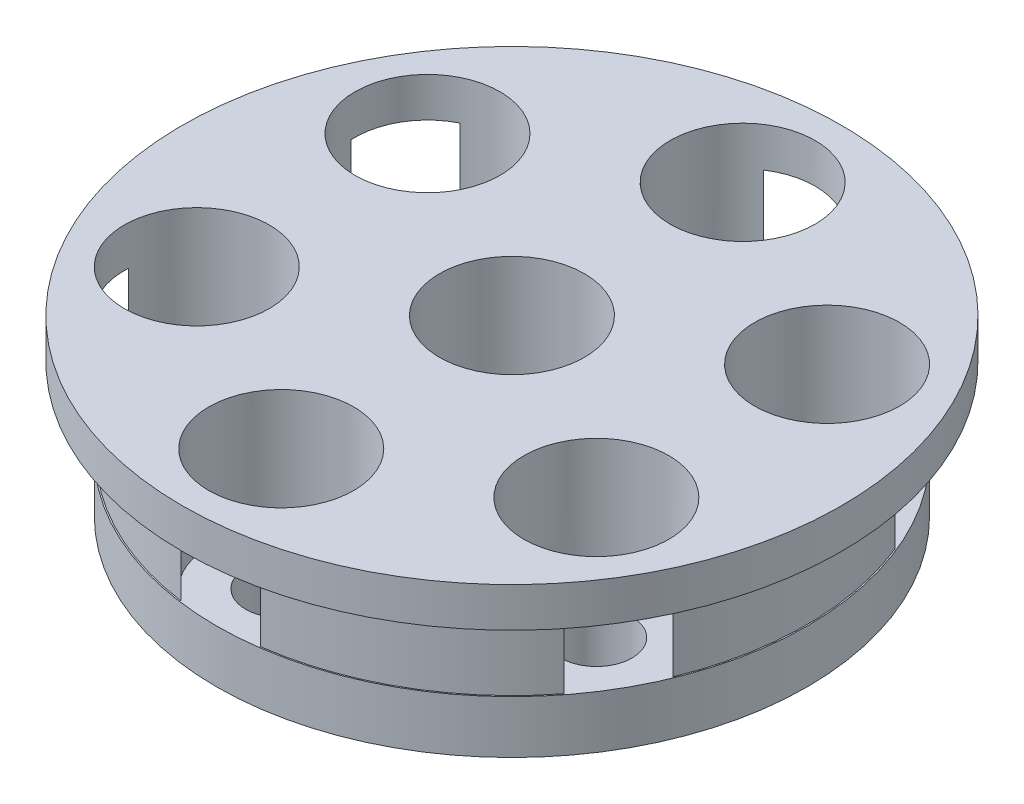
ISO-10303-21;
HEADER;
FILE_DESCRIPTION(('STEP AP214'),'2;1');
FILE_NAME('part.step','',(''),(''),'','','');
FILE_SCHEMA(('AUTOMOTIVE_DESIGN { 1 0 10303 214 1 1 1 1 }'));
ENDSEC;
DATA;
#1=APPLICATION_CONTEXT('core data for automotive mechanical design processes');
#2=APPLICATION_PROTOCOL_DEFINITION('international standard','automotive_design',2000,#1);
#3=PRODUCT_CONTEXT('',#1,'mechanical');
#4=PRODUCT('Part','Part','',(#3));
#5=PRODUCT_RELATED_PRODUCT_CATEGORY('part','',(#4));
#6=PRODUCT_DEFINITION_FORMATION('','',#4);
#7=PRODUCT_DEFINITION_CONTEXT('part definition',#1,'design');
#8=PRODUCT_DEFINITION('design','',#6,#7);
#9=PRODUCT_DEFINITION_SHAPE('','',#8);
#10=(LENGTH_UNIT() NAMED_UNIT(*) SI_UNIT(.MILLI.,.METRE.));
#11=(NAMED_UNIT(*) PLANE_ANGLE_UNIT() SI_UNIT($,.RADIAN.));
#12=(NAMED_UNIT(*) SI_UNIT($,.STERADIAN.) SOLID_ANGLE_UNIT());
#13=UNCERTAINTY_MEASURE_WITH_UNIT(LENGTH_MEASURE(1.E-05),#10,'distance_accuracy_value','');
#14=(GEOMETRIC_REPRESENTATION_CONTEXT(3) GLOBAL_UNCERTAINTY_ASSIGNED_CONTEXT((#13)) GLOBAL_UNIT_ASSIGNED_CONTEXT((#10,
#11,#12)) REPRESENTATION_CONTEXT('',''));
#15=CARTESIAN_POINT('',(0.,0.,0.));
#16=DIRECTION('',(0.,0.,1.));
#17=DIRECTION('',(1.,0.,0.));
#18=AXIS2_PLACEMENT_3D('',#15,#16,#17);
#19=CARTESIAN_POINT('',(0.,4.,0.));
#20=DIRECTION('',(0.,1.,0.));
#21=DIRECTION('',(0.,0.,1.));
#22=AXIS2_PLACEMENT_3D('',#19,#20,#21);
#23=PLANE('',#22);
#24=CARTESIAN_POINT('',(0.,4.,0.));
#25=DIRECTION('',(0.,1.,0.));
#26=DIRECTION('',(0.,0.,1.));
#27=AXIS2_PLACEMENT_3D('',#24,#25,#26);
#28=CIRCLE('',#27,22.4);
#29=CARTESIAN_POINT('',(0.,4.,22.4));
#30=VERTEX_POINT('',#29);
#31=EDGE_CURVE('E11',#30,#30,#28,.T.);
#32=ORIENTED_EDGE('',*,*,#31,.T.);
#33=EDGE_LOOP('',(#32));
#34=FACE_BOUND('',#33,.T.);
#35=CARTESIAN_POINT('',(-15.1554445662274,4.,-8.74999999999956));
#36=DIRECTION('',(0.,1.,0.));
#37=DIRECTION('',(0.,0.,1.));
#38=AXIS2_PLACEMENT_3D('',#35,#36,#37);
#39=CIRCLE('',#38,2.69999999999986);
#40=CARTESIAN_POINT('',(-15.1554445662274,4.,-6.04999999999971));
#41=VERTEX_POINT('',#40);
#42=EDGE_CURVE('E57',#41,#41,#39,.T.);
#43=ORIENTED_EDGE('',*,*,#42,.F.);
#44=EDGE_LOOP('',(#43));
#45=FACE_BOUND('',#44,.T.);
#46=CARTESIAN_POINT('',(0.,4.,-17.5));
#47=DIRECTION('',(0.,1.,0.));
#48=DIRECTION('',(0.,0.,1.));
#49=AXIS2_PLACEMENT_3D('',#46,#47,#48);
#50=CIRCLE('',#49,2.7);
#51=CARTESIAN_POINT('',(0.,4.,-14.8));
#52=VERTEX_POINT('',#51);
#53=EDGE_CURVE('E319',#52,#52,#50,.T.);
#54=ORIENTED_EDGE('',*,*,#53,.F.);
#55=EDGE_LOOP('',(#54));
#56=FACE_BOUND('',#55,.T.);
#57=CARTESIAN_POINT('',(15.1554445662276,4.,-8.75000000000018));
#58=DIRECTION('',(0.,1.,0.));
#59=DIRECTION('',(0.,0.,1.));
#60=AXIS2_PLACEMENT_3D('',#57,#58,#59);
#61=CIRCLE('',#60,2.7);
#62=CARTESIAN_POINT('',(15.1554445662276,4.,-6.05000000000019));
#63=VERTEX_POINT('',#62);
#64=EDGE_CURVE('E315',#63,#63,#61,.T.);
#65=ORIENTED_EDGE('',*,*,#64,.F.);
#66=EDGE_LOOP('',(#65));
#67=FACE_BOUND('',#66,.T.);
#68=CARTESIAN_POINT('',(15.1554445662284,4.,8.74999999999957));
#69=DIRECTION('',(0.,1.,0.));
#70=DIRECTION('',(0.,0.,1.));
#71=AXIS2_PLACEMENT_3D('',#68,#69,#70);
#72=CIRCLE('',#71,2.69999999999875);
#73=CARTESIAN_POINT('',(15.1554445662284,4.,11.4499999999983));
#74=VERTEX_POINT('',#73);
#75=EDGE_CURVE('E311',#74,#74,#72,.T.);
#76=ORIENTED_EDGE('',*,*,#75,.F.);
#77=EDGE_LOOP('',(#76));
#78=FACE_BOUND('',#77,.T.);
#79=CARTESIAN_POINT('',(9.88330434368617E-13,4.,17.5));
#80=DIRECTION('',(0.,1.,0.));
#81=DIRECTION('',(0.,0.,1.));
#82=AXIS2_PLACEMENT_3D('',#79,#80,#81);
#83=CIRCLE('',#82,2.69999999999939);
#84=CARTESIAN_POINT('',(9.88330434368617E-13,4.,20.1999999999994));
#85=VERTEX_POINT('',#84);
#86=EDGE_CURVE('E307',#85,#85,#83,.T.);
#87=ORIENTED_EDGE('',*,*,#86,.F.);
#88=EDGE_LOOP('',(#87));
#89=FACE_BOUND('',#88,.T.);
#90=CARTESIAN_POINT('',(-15.1554445662269,4.,8.75000000000044));
#91=DIRECTION('',(0.,1.,0.));
#92=DIRECTION('',(0.,0.,1.));
#93=AXIS2_PLACEMENT_3D('',#90,#91,#92);
#94=CIRCLE('',#93,2.69999999999917);
#95=CARTESIAN_POINT('',(-15.1554445662269,4.,11.4499999999996));
#96=VERTEX_POINT('',#95);
#97=EDGE_CURVE('E303',#96,#96,#94,.T.);
#98=ORIENTED_EDGE('',*,*,#97,.F.);
#99=EDGE_LOOP('',(#98));
#100=FACE_BOUND('',#99,.T.);
#101=CARTESIAN_POINT('',(0.,4.,0.));
#102=DIRECTION('',(0.,1.,0.));
#103=DIRECTION('',(0.,0.,1.));
#104=AXIS2_PLACEMENT_3D('',#101,#102,#103);
#105=CIRCLE('',#104,22.3);
#106=CARTESIAN_POINT('',(-20.646013881543,4.,-8.42805498339527));
#107=VERTEX_POINT('',#106);
#108=CARTESIAN_POINT('',(-20.6460138815428,4.,8.42805498339586));
#109=VERTEX_POINT('',#108);
#110=EDGE_CURVE('E225',#107,#109,#105,.T.);
#111=ORIENTED_EDGE('',*,*,#110,.F.);
#112=CARTESIAN_POINT('',(-15.1554445662276,4.,-8.75000000000018));
#113=DIRECTION('',(0.,1.,0.));
#114=DIRECTION('',(0.,0.,1.));
#115=AXIS2_PLACEMENT_3D('',#112,#113,#114);
#116=CIRCLE('',#115,5.5);
#117=CARTESIAN_POINT('',(-17.6219166608835,4.,-13.6659450166052));
#118=VERTEX_POINT('',#117);
#119=EDGE_CURVE('E65',#107,#118,#116,.T.);
#120=ORIENTED_EDGE('',*,*,#119,.T.);
#121=CARTESIAN_POINT('',(0.,4.,0.));
#122=DIRECTION('',(0.,1.,0.));
#123=DIRECTION('',(0.,0.,1.));
#124=AXIS2_PLACEMENT_3D('',#121,#122,#123);
#125=CIRCLE('',#124,22.3);
#126=CARTESIAN_POINT('',(-3.02409722065942,4.,-22.094));
#127=VERTEX_POINT('',#126);
#128=EDGE_CURVE('E70',#127,#118,#125,.T.);
#129=ORIENTED_EDGE('',*,*,#128,.F.);
#130=CARTESIAN_POINT('',(0.,4.,-17.5));
#131=DIRECTION('',(0.,1.,0.));
#132=DIRECTION('',(0.,0.,1.));
#133=AXIS2_PLACEMENT_3D('',#130,#131,#132);
#134=CIRCLE('',#133,5.5);
#135=CARTESIAN_POINT('',(3.02409722065942,4.,-22.094));
#136=VERTEX_POINT('',#135);
#137=EDGE_CURVE('E257',#127,#136,#134,.T.);
#138=ORIENTED_EDGE('',*,*,#137,.T.);
#139=CARTESIAN_POINT('',(0.,4.,0.));
#140=DIRECTION('',(0.,1.,0.));
#141=DIRECTION('',(0.,0.,1.));
#142=AXIS2_PLACEMENT_3D('',#139,#140,#141);
#143=CIRCLE('',#142,22.3);
#144=CARTESIAN_POINT('',(17.621916660884,4.,-13.6659450166046));
#145=VERTEX_POINT('',#144);
#146=EDGE_CURVE('E253',#145,#136,#143,.T.);
#147=ORIENTED_EDGE('',*,*,#146,.F.);
#148=CARTESIAN_POINT('',(15.1554445662279,4.,-8.7499999999997));
#149=DIRECTION('',(0.,1.,0.));
#150=DIRECTION('',(0.,0.,1.));
#151=AXIS2_PLACEMENT_3D('',#148,#149,#150);
#152=CIRCLE('',#151,5.5);
#153=CARTESIAN_POINT('',(20.6460138815433,4.,-8.42805498339463));
#154=VERTEX_POINT('',#153);
#155=EDGE_CURVE('E250',#145,#154,#152,.T.);
#156=ORIENTED_EDGE('',*,*,#155,.T.);
#157=CARTESIAN_POINT('',(0.,4.,0.));
#158=DIRECTION('',(0.,1.,0.));
#159=DIRECTION('',(0.,0.,1.));
#160=AXIS2_PLACEMENT_3D('',#157,#158,#159);
#161=CIRCLE('',#160,22.3);
#162=CARTESIAN_POINT('',(20.646013881543,4.,8.4280549833952));
#163=VERTEX_POINT('',#162);
#164=EDGE_CURVE('E246',#163,#154,#161,.T.);
#165=ORIENTED_EDGE('',*,*,#164,.F.);
#166=CARTESIAN_POINT('',(15.1554445662276,4.,8.75000000000013));
#167=DIRECTION('',(0.,1.,0.));
#168=DIRECTION('',(0.,0.,1.));
#169=AXIS2_PLACEMENT_3D('',#166,#167,#168);
#170=CIRCLE('',#169,5.5);
#171=CARTESIAN_POINT('',(17.6219166608836,4.,13.6659450166051));
#172=VERTEX_POINT('',#171);
#173=EDGE_CURVE('E243',#163,#172,#170,.T.);
#174=ORIENTED_EDGE('',*,*,#173,.T.);
#175=CARTESIAN_POINT('',(0.,4.,0.));
#176=DIRECTION('',(0.,1.,0.));
#177=DIRECTION('',(0.,0.,1.));
#178=AXIS2_PLACEMENT_3D('',#175,#176,#177);
#179=CIRCLE('',#178,22.3);
#180=CARTESIAN_POINT('',(3.02409722065878,4.,22.0940000000001));
#181=VERTEX_POINT('',#180);
#182=EDGE_CURVE('E239',#181,#172,#179,.T.);
#183=ORIENTED_EDGE('',*,*,#182,.F.);
#184=CARTESIAN_POINT('',(0.,4.,17.5000000000001));
#185=DIRECTION('',(0.,1.,0.));
#186=DIRECTION('',(0.,0.,1.));
#187=AXIS2_PLACEMENT_3D('',#184,#185,#186);
#188=CIRCLE('',#187,5.49999999999971);
#189=CARTESIAN_POINT('',(-3.02409722065893,4.,22.0940000000001));
#190=VERTEX_POINT('',#189);
#191=EDGE_CURVE('E236',#181,#190,#188,.T.);
#192=ORIENTED_EDGE('',*,*,#191,.T.);
#193=CARTESIAN_POINT('',(0.,4.,0.));
#194=DIRECTION('',(0.,1.,0.));
#195=DIRECTION('',(0.,0.,1.));
#196=AXIS2_PLACEMENT_3D('',#193,#194,#195);
#197=CIRCLE('',#196,22.3);
#198=CARTESIAN_POINT('',(-17.6219166608843,4.,13.6659450166042));
#199=VERTEX_POINT('',#198);
#200=EDGE_CURVE('E232',#199,#190,#197,.T.);
#201=ORIENTED_EDGE('',*,*,#200,.F.);
#202=CARTESIAN_POINT('',(-15.1554445662278,4.,8.75000000000003));
#203=DIRECTION('',(0.,1.,0.));
#204=DIRECTION('',(0.,0.,1.));
#205=AXIS2_PLACEMENT_3D('',#202,#203,#204);
#206=CIRCLE('',#205,5.49999999999954);
#207=EDGE_CURVE('E229',#199,#109,#206,.T.);
#208=ORIENTED_EDGE('',*,*,#207,.T.);
#209=EDGE_LOOP('',(#111,#120,#129,#138,#147,#156,#165,#174,#183,#192,#201,#208));
#210=FACE_BOUND('',#209,.T.);
#211=ADVANCED_FACE('F47',(#34,#45,#56,#67,#78,#89,#100,#210),#23,.T.);
#212=CARTESIAN_POINT('',(-15.1554445662274,4.,-8.74999999999956));
#213=DIRECTION('',(0.,-1.,0.));
#214=DIRECTION('',(0.,0.,-1.));
#215=AXIS2_PLACEMENT_3D('',#212,#213,#214);
#216=CYLINDRICAL_SURFACE('',#215,2.69999999999986);
#217=ORIENTED_EDGE('',*,*,#42,.T.);
#218=EDGE_LOOP('',(#217));
#219=FACE_BOUND('',#218,.T.);
#220=CARTESIAN_POINT('',(-15.1554445662274,0.,-8.74999999999956));
#221=DIRECTION('',(0.,1.,0.));
#222=DIRECTION('',(0.,0.,1.));
#223=AXIS2_PLACEMENT_3D('',#220,#221,#222);
#224=CIRCLE('',#223,2.69999999999986);
#225=CARTESIAN_POINT('',(-15.1554445662274,0.,-6.04999999999971));
#226=VERTEX_POINT('',#225);
#227=EDGE_CURVE('E352',#226,#226,#224,.T.);
#228=ORIENTED_EDGE('',*,*,#227,.F.);
#229=EDGE_LOOP('',(#228));
#230=FACE_BOUND('',#229,.T.);
#231=ADVANCED_FACE('F378',(#219,#230),#216,.F.);
#232=CARTESIAN_POINT('',(0.,4.,0.));
#233=DIRECTION('',(0.,-1.,0.));
#234=DIRECTION('',(0.,0.,-1.));
#235=AXIS2_PLACEMENT_3D('',#232,#233,#234);
#236=CYLINDRICAL_SURFACE('',#235,7.7);
#237=CARTESIAN_POINT('',(0.,4.,0.));
#238=DIRECTION('',(0.,1.,0.));
#239=DIRECTION('',(0.,0.,1.));
#240=AXIS2_PLACEMENT_3D('',#237,#238,#239);
#241=CIRCLE('',#240,7.7);
#242=CARTESIAN_POINT('',(0.,4.,7.7));
#243=VERTEX_POINT('',#242);
#244=EDGE_CURVE('E302',#243,#243,#241,.T.);
#245=ORIENTED_EDGE('',*,*,#244,.T.);
#246=EDGE_LOOP('',(#245));
#247=FACE_BOUND('',#246,.T.);
#248=CARTESIAN_POINT('',(0.,0.,0.));
#249=DIRECTION('',(0.,1.,0.));
#250=DIRECTION('',(0.,0.,1.));
#251=AXIS2_PLACEMENT_3D('',#248,#249,#250);
#252=CIRCLE('',#251,7.7);
#253=CARTESIAN_POINT('',(0.,0.,7.7));
#254=VERTEX_POINT('',#253);
#255=EDGE_CURVE('E349',#254,#254,#252,.T.);
#256=ORIENTED_EDGE('',*,*,#255,.F.);
#257=EDGE_LOOP('',(#256));
#258=FACE_BOUND('',#257,.T.);
#259=ADVANCED_FACE('F384',(#247,#258),#236,.F.);
#260=CARTESIAN_POINT('',(0.,4.,-17.5));
#261=DIRECTION('',(0.,-1.,0.));
#262=DIRECTION('',(0.,0.,-1.));
#263=AXIS2_PLACEMENT_3D('',#260,#261,#262);
#264=CYLINDRICAL_SURFACE('',#263,2.7);
#265=ORIENTED_EDGE('',*,*,#53,.T.);
#266=EDGE_LOOP('',(#265));
#267=FACE_BOUND('',#266,.T.);
#268=CARTESIAN_POINT('',(0.,0.,-17.5));
#269=DIRECTION('',(0.,1.,0.));
#270=DIRECTION('',(0.,0.,1.));
#271=AXIS2_PLACEMENT_3D('',#268,#269,#270);
#272=CIRCLE('',#271,2.7);
#273=CARTESIAN_POINT('',(0.,0.,-14.8));
#274=VERTEX_POINT('',#273);
#275=EDGE_CURVE('E345',#274,#274,#272,.T.);
#276=ORIENTED_EDGE('',*,*,#275,.F.);
#277=EDGE_LOOP('',(#276));
#278=FACE_BOUND('',#277,.T.);
#279=ADVANCED_FACE('F643',(#267,#278),#264,.F.);
#280=CARTESIAN_POINT('',(15.1554445662276,4.,-8.75000000000018));
#281=DIRECTION('',(0.,-1.,0.));
#282=DIRECTION('',(0.,0.,-1.));
#283=AXIS2_PLACEMENT_3D('',#280,#281,#282);
#284=CYLINDRICAL_SURFACE('',#283,2.7);
#285=ORIENTED_EDGE('',*,*,#64,.T.);
#286=EDGE_LOOP('',(#285));
#287=FACE_BOUND('',#286,.T.);
#288=CARTESIAN_POINT('',(15.1554445662276,0.,-8.75000000000018));
#289=DIRECTION('',(0.,1.,0.));
#290=DIRECTION('',(0.,0.,1.));
#291=AXIS2_PLACEMENT_3D('',#288,#289,#290);
#292=CIRCLE('',#291,2.7);
#293=CARTESIAN_POINT('',(15.1554445662276,0.,-6.05000000000019));
#294=VERTEX_POINT('',#293);
#295=EDGE_CURVE('E341',#294,#294,#292,.T.);
#296=ORIENTED_EDGE('',*,*,#295,.F.);
#297=EDGE_LOOP('',(#296));
#298=FACE_BOUND('',#297,.T.);
#299=ADVANCED_FACE('F634',(#287,#298),#284,.F.);
#300=CARTESIAN_POINT('',(15.1554445662284,4.,8.74999999999957));
#301=DIRECTION('',(0.,-1.,0.));
#302=DIRECTION('',(0.,0.,-1.));
#303=AXIS2_PLACEMENT_3D('',#300,#301,#302);
#304=CYLINDRICAL_SURFACE('',#303,2.69999999999875);
#305=ORIENTED_EDGE('',*,*,#75,.T.);
#306=EDGE_LOOP('',(#305));
#307=FACE_BOUND('',#306,.T.);
#308=CARTESIAN_POINT('',(15.1554445662284,0.,8.74999999999957));
#309=DIRECTION('',(0.,1.,0.));
#310=DIRECTION('',(0.,0.,1.));
#311=AXIS2_PLACEMENT_3D('',#308,#309,#310);
#312=CIRCLE('',#311,2.69999999999875);
#313=CARTESIAN_POINT('',(15.1554445662284,0.,11.4499999999983));
#314=VERTEX_POINT('',#313);
#315=EDGE_CURVE('E337',#314,#314,#312,.T.);
#316=ORIENTED_EDGE('',*,*,#315,.F.);
#317=EDGE_LOOP('',(#316));
#318=FACE_BOUND('',#317,.T.);
#319=ADVANCED_FACE('F626',(#307,#318),#304,.F.);
#320=CARTESIAN_POINT('',(9.88330434368617E-13,4.,17.5));
#321=DIRECTION('',(0.,-1.,0.));
#322=DIRECTION('',(0.,0.,-1.));
#323=AXIS2_PLACEMENT_3D('',#320,#321,#322);
#324=CYLINDRICAL_SURFACE('',#323,2.69999999999939);
#325=ORIENTED_EDGE('',*,*,#86,.T.);
#326=EDGE_LOOP('',(#325));
#327=FACE_BOUND('',#326,.T.);
#328=CARTESIAN_POINT('',(9.88330434368617E-13,0.,17.5));
#329=DIRECTION('',(0.,1.,0.));
#330=DIRECTION('',(0.,0.,1.));
#331=AXIS2_PLACEMENT_3D('',#328,#329,#330);
#332=CIRCLE('',#331,2.69999999999939);
#333=CARTESIAN_POINT('',(9.88330434368617E-13,0.,20.1999999999994));
#334=VERTEX_POINT('',#333);
#335=EDGE_CURVE('E333',#334,#334,#332,.T.);
#336=ORIENTED_EDGE('',*,*,#335,.F.);
#337=EDGE_LOOP('',(#336));
#338=FACE_BOUND('',#337,.T.);
#339=ADVANCED_FACE('F618',(#327,#338),#324,.F.);
#340=CARTESIAN_POINT('',(-15.1554445662269,4.,8.75000000000044));
#341=DIRECTION('',(0.,-1.,0.));
#342=DIRECTION('',(0.,0.,-1.));
#343=AXIS2_PLACEMENT_3D('',#340,#341,#342);
#344=CYLINDRICAL_SURFACE('',#343,2.69999999999917);
#345=ORIENTED_EDGE('',*,*,#97,.T.);
#346=EDGE_LOOP('',(#345));
#347=FACE_BOUND('',#346,.T.);
#348=CARTESIAN_POINT('',(-15.1554445662269,0.,8.75000000000044));
#349=DIRECTION('',(0.,1.,0.));
#350=DIRECTION('',(0.,0.,1.));
#351=AXIS2_PLACEMENT_3D('',#348,#349,#350);
#352=CIRCLE('',#351,2.69999999999917);
#353=CARTESIAN_POINT('',(-15.1554445662269,0.,11.4499999999996));
#354=VERTEX_POINT('',#353);
#355=EDGE_CURVE('E326',#354,#354,#352,.T.);
#356=ORIENTED_EDGE('',*,*,#355,.F.);
#357=EDGE_LOOP('',(#356));
#358=FACE_BOUND('',#357,.T.);
#359=ADVANCED_FACE('F49',(#347,#358),#344,.F.);
#360=CARTESIAN_POINT('',(0.,4.,0.));
#361=DIRECTION('',(0.,-1.,0.));
#362=DIRECTION('',(0.,0.,-1.));
#363=AXIS2_PLACEMENT_3D('',#360,#361,#362);
#364=CYLINDRICAL_SURFACE('',#363,22.4);
#365=ORIENTED_EDGE('',*,*,#31,.F.);
#366=EDGE_LOOP('',(#365));
#367=FACE_BOUND('',#366,.T.);
#368=CARTESIAN_POINT('',(0.,0.,0.));
#369=DIRECTION('',(0.,1.,0.));
#370=DIRECTION('',(0.,0.,1.));
#371=AXIS2_PLACEMENT_3D('',#368,#369,#370);
#372=CIRCLE('',#371,22.4);
#373=CARTESIAN_POINT('',(0.,0.,22.4));
#374=VERTEX_POINT('',#373);
#375=EDGE_CURVE('E51',#374,#374,#372,.T.);
#376=ORIENTED_EDGE('',*,*,#375,.T.);
#377=EDGE_LOOP('',(#376));
#378=FACE_BOUND('',#377,.T.);
#379=ADVANCED_FACE('F361',(#367,#378),#364,.T.);
#380=CARTESIAN_POINT('',(0.,0.,0.));
#381=DIRECTION('',(0.,1.,0.));
#382=DIRECTION('',(0.,0.,1.));
#383=AXIS2_PLACEMENT_3D('',#380,#381,#382);
#384=PLANE('',#383);
#385=ORIENTED_EDGE('',*,*,#355,.T.);
#386=EDGE_LOOP('',(#385));
#387=FACE_BOUND('',#386,.T.);
#388=ORIENTED_EDGE('',*,*,#335,.T.);
#389=EDGE_LOOP('',(#388));
#390=FACE_BOUND('',#389,.T.);
#391=ORIENTED_EDGE('',*,*,#315,.T.);
#392=EDGE_LOOP('',(#391));
#393=FACE_BOUND('',#392,.T.);
#394=ORIENTED_EDGE('',*,*,#295,.T.);
#395=EDGE_LOOP('',(#394));
#396=FACE_BOUND('',#395,.T.);
#397=ORIENTED_EDGE('',*,*,#275,.T.);
#398=EDGE_LOOP('',(#397));
#399=FACE_BOUND('',#398,.T.);
#400=ORIENTED_EDGE('',*,*,#255,.T.);
#401=EDGE_LOOP('',(#400));
#402=FACE_BOUND('',#401,.T.);
#403=ORIENTED_EDGE('',*,*,#227,.T.);
#404=EDGE_LOOP('',(#403));
#405=FACE_BOUND('',#404,.T.);
#406=ORIENTED_EDGE('',*,*,#375,.F.);
#407=EDGE_LOOP('',(#406));
#408=FACE_BOUND('',#407,.T.);
#409=ADVANCED_FACE('F363',(#387,#390,#393,#396,#399,#402,#405,#408),#384,.F.);
#410=CARTESIAN_POINT('',(-15.1554445662276,10.2,-8.75000000000018));
#411=DIRECTION('',(0.,-1.,0.));
#412=DIRECTION('',(0.,0.,-1.));
#413=AXIS2_PLACEMENT_3D('',#410,#411,#412);
#414=CYLINDRICAL_SURFACE('',#413,5.5);
#415=ORIENTED_EDGE('',*,*,#119,.F.);
#416=DIRECTION('',(0.,-1.,0.));
#417=VECTOR('',#416,1.);
#418=CARTESIAN_POINT('',(-20.646013881543,10.2,-8.42805498339527));
#419=LINE('',#418,#417);
#420=CARTESIAN_POINT('',(-20.646013881543,10.2,-8.42805498339527));
#421=VERTEX_POINT('',#420);
#422=EDGE_CURVE('E161',#421,#107,#419,.T.);
#423=ORIENTED_EDGE('',*,*,#422,.F.);
#424=CARTESIAN_POINT('',(-15.1554445662274,10.2,-8.74999999999956));
#425=DIRECTION('',(0.,1.,0.));
#426=DIRECTION('',(0.,0.,1.));
#427=AXIS2_PLACEMENT_3D('',#424,#425,#426);
#428=CIRCLE('',#427,5.49999999999956);
#429=CARTESIAN_POINT('',(-17.621916660885,10.2,-13.6659450166032));
#430=VERTEX_POINT('',#429);
#431=EDGE_CURVE('E151',#430,#421,#428,.T.);
#432=ORIENTED_EDGE('',*,*,#431,.F.);
#433=DIRECTION('',(0.,-1.,0.));
#434=VECTOR('',#433,1.);
#435=CARTESIAN_POINT('',(-17.6219166608835,10.2,-13.6659450166052));
#436=LINE('',#435,#434);
#437=EDGE_CURVE('E137',#430,#118,#436,.T.);
#438=ORIENTED_EDGE('',*,*,#437,.T.);
#439=EDGE_LOOP('',(#415,#423,#432,#438));
#440=FACE_BOUND('',#439,.T.);
#441=CARTESIAN_POINT('',(-15.1554445662274,13.2,-8.74999999999956));
#442=DIRECTION('',(0.,1.,0.));
#443=DIRECTION('',(0.,0.,1.));
#444=AXIS2_PLACEMENT_3D('',#441,#442,#443);
#445=CIRCLE('',#444,5.49999999999956);
#446=CARTESIAN_POINT('',(-15.1554445662274,13.2,-3.25));
#447=VERTEX_POINT('',#446);
#448=EDGE_CURVE('E164',#447,#447,#445,.T.);
#449=ORIENTED_EDGE('',*,*,#448,.T.);
#450=EDGE_LOOP('',(#449));
#451=FACE_BOUND('',#450,.T.);
#452=ADVANCED_FACE('F158',(#440,#451),#414,.F.);
#453=CARTESIAN_POINT('',(0.,10.2,0.));
#454=DIRECTION('',(0.,-1.,0.));
#455=DIRECTION('',(0.,0.,-1.));
#456=AXIS2_PLACEMENT_3D('',#453,#454,#455);
#457=CYLINDRICAL_SURFACE('',#456,22.3);
#458=ORIENTED_EDGE('',*,*,#110,.T.);
#459=DIRECTION('',(0.,-1.,0.));
#460=VECTOR('',#459,1.);
#461=CARTESIAN_POINT('',(-20.6460138815428,10.2,8.42805498339586));
#462=LINE('',#461,#460);
#463=CARTESIAN_POINT('',(-20.6460138815428,10.2,8.42805498339586));
#464=VERTEX_POINT('',#463);
#465=EDGE_CURVE('E296',#464,#109,#462,.T.);
#466=ORIENTED_EDGE('',*,*,#465,.F.);
#467=CARTESIAN_POINT('',(0.,10.2,0.));
#468=DIRECTION('',(0.,1.,0.));
#469=DIRECTION('',(0.,0.,1.));
#470=AXIS2_PLACEMENT_3D('',#467,#468,#469);
#471=CIRCLE('',#470,22.3);
#472=EDGE_CURVE('E203',#421,#464,#471,.T.);
#473=ORIENTED_EDGE('',*,*,#472,.F.);
#474=ORIENTED_EDGE('',*,*,#422,.T.);
#475=EDGE_LOOP('',(#458,#466,#473,#474));
#476=FACE_BOUND('',#475,.T.);
#477=ADVANCED_FACE('F372',(#476),#457,.T.);
#478=CARTESIAN_POINT('',(-15.1554445662278,10.2,8.75000000000003));
#479=DIRECTION('',(0.,-1.,0.));
#480=DIRECTION('',(0.,0.,-1.));
#481=AXIS2_PLACEMENT_3D('',#478,#479,#480);
#482=CYLINDRICAL_SURFACE('',#481,5.49999999999954);
#483=ORIENTED_EDGE('',*,*,#207,.F.);
#484=DIRECTION('',(0.,-1.,0.));
#485=VECTOR('',#484,1.);
#486=CARTESIAN_POINT('',(-17.6219166608843,10.2,13.6659450166042));
#487=LINE('',#486,#485);
#488=CARTESIAN_POINT('',(-17.6219166608843,10.2,13.6659450166042));
#489=VERTEX_POINT('',#488);
#490=EDGE_CURVE('E292',#489,#199,#487,.T.);
#491=ORIENTED_EDGE('',*,*,#490,.F.);
#492=CARTESIAN_POINT('',(-15.1554445662278,10.2,8.75000000000003));
#493=DIRECTION('',(0.,1.,0.));
#494=DIRECTION('',(0.,0.,1.));
#495=AXIS2_PLACEMENT_3D('',#492,#493,#494);
#496=CIRCLE('',#495,5.49999999999954);
#497=EDGE_CURVE('E172',#464,#489,#496,.T.);
#498=ORIENTED_EDGE('',*,*,#497,.F.);
#499=ORIENTED_EDGE('',*,*,#465,.T.);
#500=EDGE_LOOP('',(#483,#491,#498,#499));
#501=FACE_BOUND('',#500,.T.);
#502=CARTESIAN_POINT('',(-15.1554445662278,13.2,8.75000000000003));
#503=DIRECTION('',(0.,1.,0.));
#504=DIRECTION('',(0.,0.,1.));
#505=AXIS2_PLACEMENT_3D('',#502,#503,#504);
#506=CIRCLE('',#505,5.49999999999954);
#507=CARTESIAN_POINT('',(-15.1554445662278,13.2,14.2499999999996));
#508=VERTEX_POINT('',#507);
#509=EDGE_CURVE('E165',#508,#508,#506,.T.);
#510=ORIENTED_EDGE('',*,*,#509,.T.);
#511=EDGE_LOOP('',(#510));
#512=FACE_BOUND('',#511,.T.);
#513=ADVANCED_FACE('F396',(#501,#512),#482,.F.);
#514=CARTESIAN_POINT('',(0.,10.2,0.));
#515=DIRECTION('',(0.,-1.,0.));
#516=DIRECTION('',(0.,0.,-1.));
#517=AXIS2_PLACEMENT_3D('',#514,#515,#516);
#518=CYLINDRICAL_SURFACE('',#517,22.3);
#519=ORIENTED_EDGE('',*,*,#200,.T.);
#520=DIRECTION('',(0.,-1.,0.));
#521=VECTOR('',#520,1.);
#522=CARTESIAN_POINT('',(-3.02409722065893,10.2,22.0940000000001));
#523=LINE('',#522,#521);
#524=CARTESIAN_POINT('',(-3.02409722065893,10.2,22.0940000000001));
#525=VERTEX_POINT('',#524);
#526=EDGE_CURVE('E288',#525,#190,#523,.T.);
#527=ORIENTED_EDGE('',*,*,#526,.F.);
#528=CARTESIAN_POINT('',(0.,10.2,0.));
#529=DIRECTION('',(0.,1.,0.));
#530=DIRECTION('',(0.,0.,1.));
#531=AXIS2_PLACEMENT_3D('',#528,#529,#530);
#532=CIRCLE('',#531,22.3);
#533=EDGE_CURVE('E206',#489,#525,#532,.T.);
#534=ORIENTED_EDGE('',*,*,#533,.F.);
#535=ORIENTED_EDGE('',*,*,#490,.T.);
#536=EDGE_LOOP('',(#519,#527,#534,#535));
#537=FACE_BOUND('',#536,.T.);
#538=ADVANCED_FACE('F400',(#537),#518,.T.);
#539=CARTESIAN_POINT('',(0.,10.2,17.5000000000001));
#540=DIRECTION('',(0.,-1.,0.));
#541=DIRECTION('',(0.,0.,-1.));
#542=AXIS2_PLACEMENT_3D('',#539,#540,#541);
#543=CYLINDRICAL_SURFACE('',#542,5.49999999999971);
#544=ORIENTED_EDGE('',*,*,#191,.F.);
#545=DIRECTION('',(0.,-1.,0.));
#546=VECTOR('',#545,1.);
#547=CARTESIAN_POINT('',(3.02409722065878,10.2,22.0940000000001));
#548=LINE('',#547,#546);
#549=CARTESIAN_POINT('',(3.02409722065878,10.2,22.0940000000001));
#550=VERTEX_POINT('',#549);
#551=EDGE_CURVE('E284',#550,#181,#548,.T.);
#552=ORIENTED_EDGE('',*,*,#551,.F.);
#553=CARTESIAN_POINT('',(9.88330434368617E-13,10.2,17.5));
#554=DIRECTION('',(0.,1.,0.));
#555=DIRECTION('',(0.,0.,1.));
#556=AXIS2_PLACEMENT_3D('',#553,#554,#555);
#557=CIRCLE('',#556,5.4999999999987);
#558=EDGE_CURVE('E470',#525,#550,#557,.T.);
#559=ORIENTED_EDGE('',*,*,#558,.F.);
#560=ORIENTED_EDGE('',*,*,#526,.T.);
#561=EDGE_LOOP('',(#544,#552,#559,#560));
#562=FACE_BOUND('',#561,.T.);
#563=CARTESIAN_POINT('',(9.88330434368617E-13,13.2,17.5));
#564=DIRECTION('',(0.,1.,0.));
#565=DIRECTION('',(0.,0.,1.));
#566=AXIS2_PLACEMENT_3D('',#563,#564,#565);
#567=CIRCLE('',#566,5.4999999999987);
#568=CARTESIAN_POINT('',(9.88330434368617E-13,13.2,22.9999999999987));
#569=VERTEX_POINT('',#568);
#570=EDGE_CURVE('E452',#569,#569,#567,.T.);
#571=ORIENTED_EDGE('',*,*,#570,.T.);
#572=EDGE_LOOP('',(#571));
#573=FACE_BOUND('',#572,.T.);
#574=ADVANCED_FACE('F404',(#562,#573),#543,.F.);
#575=CARTESIAN_POINT('',(0.,10.2,0.));
#576=DIRECTION('',(0.,-1.,0.));
#577=DIRECTION('',(0.,0.,-1.));
#578=AXIS2_PLACEMENT_3D('',#575,#576,#577);
#579=CYLINDRICAL_SURFACE('',#578,22.3);
#580=ORIENTED_EDGE('',*,*,#182,.T.);
#581=DIRECTION('',(0.,-1.,0.));
#582=VECTOR('',#581,1.);
#583=CARTESIAN_POINT('',(17.6219166608836,10.2,13.6659450166051));
#584=LINE('',#583,#582);
#585=CARTESIAN_POINT('',(17.6219166608836,10.2,13.6659450166051));
#586=VERTEX_POINT('',#585);
#587=EDGE_CURVE('E280',#586,#172,#584,.T.);
#588=ORIENTED_EDGE('',*,*,#587,.F.);
#589=CARTESIAN_POINT('',(0.,10.2,0.));
#590=DIRECTION('',(0.,1.,0.));
#591=DIRECTION('',(0.,0.,1.));
#592=AXIS2_PLACEMENT_3D('',#589,#590,#591);
#593=CIRCLE('',#592,22.3);
#594=EDGE_CURVE('E210',#550,#586,#593,.T.);
#595=ORIENTED_EDGE('',*,*,#594,.F.);
#596=ORIENTED_EDGE('',*,*,#551,.T.);
#597=EDGE_LOOP('',(#580,#588,#595,#596));
#598=FACE_BOUND('',#597,.T.);
#599=ADVANCED_FACE('F408',(#598),#579,.T.);
#600=CARTESIAN_POINT('',(15.1554445662276,10.2,8.75000000000013));
#601=DIRECTION('',(0.,-1.,0.));
#602=DIRECTION('',(0.,0.,-1.));
#603=AXIS2_PLACEMENT_3D('',#600,#601,#602);
#604=CYLINDRICAL_SURFACE('',#603,5.5);
#605=ORIENTED_EDGE('',*,*,#173,.F.);
#606=DIRECTION('',(0.,-1.,0.));
#607=VECTOR('',#606,1.);
#608=CARTESIAN_POINT('',(20.646013881543,10.2,8.4280549833952));
#609=LINE('',#608,#607);
#610=CARTESIAN_POINT('',(20.646013881543,10.2,8.4280549833952));
#611=VERTEX_POINT('',#610);
#612=EDGE_CURVE('E276',#611,#163,#609,.T.);
#613=ORIENTED_EDGE('',*,*,#612,.F.);
#614=CARTESIAN_POINT('',(15.1554445662284,10.2,8.74999999999957));
#615=DIRECTION('',(0.,1.,0.));
#616=DIRECTION('',(0.,0.,1.));
#617=AXIS2_PLACEMENT_3D('',#614,#615,#616);
#618=CIRCLE('',#617,5.49999999999903);
#619=EDGE_CURVE('E471',#586,#611,#618,.T.);
#620=ORIENTED_EDGE('',*,*,#619,.F.);
#621=ORIENTED_EDGE('',*,*,#587,.T.);
#622=EDGE_LOOP('',(#605,#613,#620,#621));
#623=FACE_BOUND('',#622,.T.);
#624=CARTESIAN_POINT('',(15.1554445662284,13.2,8.74999999999957));
#625=DIRECTION('',(0.,1.,0.));
#626=DIRECTION('',(0.,0.,1.));
#627=AXIS2_PLACEMENT_3D('',#624,#625,#626);
#628=CIRCLE('',#627,5.49999999999903);
#629=CARTESIAN_POINT('',(15.1554445662284,13.2,14.2499999999986));
#630=VERTEX_POINT('',#629);
#631=EDGE_CURVE('E467',#630,#630,#628,.T.);
#632=ORIENTED_EDGE('',*,*,#631,.T.);
#633=EDGE_LOOP('',(#632));
#634=FACE_BOUND('',#633,.T.);
#635=ADVANCED_FACE('F412',(#623,#634),#604,.F.);
#636=CARTESIAN_POINT('',(0.,10.2,0.));
#637=DIRECTION('',(0.,-1.,0.));
#638=DIRECTION('',(0.,0.,-1.));
#639=AXIS2_PLACEMENT_3D('',#636,#637,#638);
#640=CYLINDRICAL_SURFACE('',#639,22.3);
#641=ORIENTED_EDGE('',*,*,#164,.T.);
#642=DIRECTION('',(0.,-1.,0.));
#643=VECTOR('',#642,1.);
#644=CARTESIAN_POINT('',(20.6460138815433,10.2,-8.42805498339463));
#645=LINE('',#644,#643);
#646=CARTESIAN_POINT('',(20.6460138815433,10.2,-8.42805498339463));
#647=VERTEX_POINT('',#646);
#648=EDGE_CURVE('E272',#647,#154,#645,.T.);
#649=ORIENTED_EDGE('',*,*,#648,.F.);
#650=CARTESIAN_POINT('',(0.,10.2,0.));
#651=DIRECTION('',(0.,1.,0.));
#652=DIRECTION('',(0.,0.,1.));
#653=AXIS2_PLACEMENT_3D('',#650,#651,#652);
#654=CIRCLE('',#653,22.3);
#655=EDGE_CURVE('E214',#611,#647,#654,.T.);
#656=ORIENTED_EDGE('',*,*,#655,.F.);
#657=ORIENTED_EDGE('',*,*,#612,.T.);
#658=EDGE_LOOP('',(#641,#649,#656,#657));
#659=FACE_BOUND('',#658,.T.);
#660=ADVANCED_FACE('F416',(#659),#640,.T.);
#661=CARTESIAN_POINT('',(15.1554445662279,10.2,-8.7499999999997));
#662=DIRECTION('',(0.,-1.,0.));
#663=DIRECTION('',(0.,0.,-1.));
#664=AXIS2_PLACEMENT_3D('',#661,#662,#663);
#665=CYLINDRICAL_SURFACE('',#664,5.5);
#666=ORIENTED_EDGE('',*,*,#155,.F.);
#667=DIRECTION('',(0.,-1.,0.));
#668=VECTOR('',#667,1.);
#669=CARTESIAN_POINT('',(17.621916660884,10.2,-13.6659450166046));
#670=LINE('',#669,#668);
#671=CARTESIAN_POINT('',(17.621916660884,10.2,-13.6659450166046));
#672=VERTEX_POINT('',#671);
#673=EDGE_CURVE('E268',#672,#145,#670,.T.);
#674=ORIENTED_EDGE('',*,*,#673,.F.);
#675=CARTESIAN_POINT('',(15.1554445662276,10.2,-8.75000000000018));
#676=DIRECTION('',(0.,1.,0.));
#677=DIRECTION('',(0.,0.,1.));
#678=AXIS2_PLACEMENT_3D('',#675,#676,#677);
#679=CIRCLE('',#678,5.50000000000052);
#680=EDGE_CURVE('E180',#647,#672,#679,.T.);
#681=ORIENTED_EDGE('',*,*,#680,.F.);
#682=ORIENTED_EDGE('',*,*,#648,.T.);
#683=EDGE_LOOP('',(#666,#674,#681,#682));
#684=FACE_BOUND('',#683,.T.);
#685=CARTESIAN_POINT('',(15.1554445662276,13.2,-8.75000000000018));
#686=DIRECTION('',(0.,1.,0.));
#687=DIRECTION('',(0.,0.,1.));
#688=AXIS2_PLACEMENT_3D('',#685,#686,#687);
#689=CIRCLE('',#688,5.50000000000052);
#690=CARTESIAN_POINT('',(15.1554445662276,13.2,-3.24999999999966));
#691=VERTEX_POINT('',#690);
#692=EDGE_CURVE('E183',#691,#691,#689,.T.);
#693=ORIENTED_EDGE('',*,*,#692,.T.);
#694=EDGE_LOOP('',(#693));
#695=FACE_BOUND('',#694,.T.);
#696=ADVANCED_FACE('F420',(#684,#695),#665,.F.);
#697=CARTESIAN_POINT('',(0.,10.2,0.));
#698=DIRECTION('',(0.,-1.,0.));
#699=DIRECTION('',(0.,0.,-1.));
#700=AXIS2_PLACEMENT_3D('',#697,#698,#699);
#701=CYLINDRICAL_SURFACE('',#700,22.3);
#702=ORIENTED_EDGE('',*,*,#146,.T.);
#703=DIRECTION('',(0.,-1.,0.));
#704=VECTOR('',#703,1.);
#705=CARTESIAN_POINT('',(3.02409722065942,10.2,-22.094));
#706=LINE('',#705,#704);
#707=CARTESIAN_POINT('',(3.02409722065942,10.2,-22.094));
#708=VERTEX_POINT('',#707);
#709=EDGE_CURVE('E264',#708,#136,#706,.T.);
#710=ORIENTED_EDGE('',*,*,#709,.F.);
#711=CARTESIAN_POINT('',(0.,10.2,0.));
#712=DIRECTION('',(0.,1.,0.));
#713=DIRECTION('',(0.,0.,1.));
#714=AXIS2_PLACEMENT_3D('',#711,#712,#713);
#715=CIRCLE('',#714,22.3);
#716=EDGE_CURVE('E156',#672,#708,#715,.T.);
#717=ORIENTED_EDGE('',*,*,#716,.F.);
#718=ORIENTED_EDGE('',*,*,#673,.T.);
#719=EDGE_LOOP('',(#702,#710,#717,#718));
#720=FACE_BOUND('',#719,.T.);
#721=ADVANCED_FACE('F424',(#720),#701,.T.);
#722=CARTESIAN_POINT('',(0.,10.2,-17.5));
#723=DIRECTION('',(0.,-1.,0.));
#724=DIRECTION('',(0.,0.,-1.));
#725=AXIS2_PLACEMENT_3D('',#722,#723,#724);
#726=CYLINDRICAL_SURFACE('',#725,5.5);
#727=ORIENTED_EDGE('',*,*,#137,.F.);
#728=DIRECTION('',(0.,-1.,0.));
#729=VECTOR('',#728,1.);
#730=CARTESIAN_POINT('',(-3.02409722065942,10.2,-22.094));
#731=LINE('',#730,#729);
#732=CARTESIAN_POINT('',(-3.02409722065942,10.2,-22.094));
#733=VERTEX_POINT('',#732);
#734=EDGE_CURVE('E145',#733,#127,#731,.T.);
#735=ORIENTED_EDGE('',*,*,#734,.F.);
#736=CARTESIAN_POINT('',(0.,10.2,-17.5));
#737=DIRECTION('',(0.,1.,0.));
#738=DIRECTION('',(0.,0.,1.));
#739=AXIS2_PLACEMENT_3D('',#736,#737,#738);
#740=CIRCLE('',#739,5.5);
#741=EDGE_CURVE('E154',#708,#733,#740,.T.);
#742=ORIENTED_EDGE('',*,*,#741,.F.);
#743=ORIENTED_EDGE('',*,*,#709,.T.);
#744=EDGE_LOOP('',(#727,#735,#742,#743));
#745=FACE_BOUND('',#744,.T.);
#746=CARTESIAN_POINT('',(0.,13.2,-17.5));
#747=DIRECTION('',(0.,1.,0.));
#748=DIRECTION('',(0.,0.,1.));
#749=AXIS2_PLACEMENT_3D('',#746,#747,#748);
#750=CIRCLE('',#749,5.5);
#751=CARTESIAN_POINT('',(0.,13.2,-12.));
#752=VERTEX_POINT('',#751);
#753=EDGE_CURVE('E176',#752,#752,#750,.T.);
#754=ORIENTED_EDGE('',*,*,#753,.T.);
#755=EDGE_LOOP('',(#754));
#756=FACE_BOUND('',#755,.T.);
#757=ADVANCED_FACE('F391',(#745,#756),#726,.F.);
#758=CARTESIAN_POINT('',(0.,10.2,0.));
#759=DIRECTION('',(0.,-1.,0.));
#760=DIRECTION('',(0.,0.,-1.));
#761=AXIS2_PLACEMENT_3D('',#758,#759,#760);
#762=CYLINDRICAL_SURFACE('',#761,5.5);
#763=CARTESIAN_POINT('',(0.,4.,0.));
#764=DIRECTION('',(0.,1.,0.));
#765=DIRECTION('',(0.,0.,1.));
#766=AXIS2_PLACEMENT_3D('',#763,#764,#765);
#767=CIRCLE('',#766,5.5);
#768=CARTESIAN_POINT('',(0.,4.,-5.5));
#769=VERTEX_POINT('',#768);
#770=EDGE_CURVE('E199',#769,#769,#767,.T.);
#771=CARTESIAN_POINT('',(0.,13.2,0.));
#772=DIRECTION('',(0.,1.,0.));
#773=DIRECTION('',(0.,0.,1.));
#774=AXIS2_PLACEMENT_3D('',#771,#772,#773);
#775=CIRCLE('',#774,5.5);
#776=CARTESIAN_POINT('',(0.,13.2,-5.5));
#777=VERTEX_POINT('',#776);
#778=EDGE_CURVE('E187',#777,#777,#775,.T.);
#779=CARTESIAN_POINT('',(0.,4.,-5.5));
#780=CARTESIAN_POINT('',(0.,4.09583333333333,-5.5));
#781=CARTESIAN_POINT('',(0.,4.19166666666667,-5.5));
#782=CARTESIAN_POINT('',(0.,4.38333333333333,-5.5));
#783=CARTESIAN_POINT('',(0.,4.47916666666667,-5.5));
#784=CARTESIAN_POINT('',(0.,4.67083333333333,-5.5));
#785=CARTESIAN_POINT('',(0.,4.76666666666667,-5.5));
#786=CARTESIAN_POINT('',(0.,4.95833333333333,-5.5));
#787=CARTESIAN_POINT('',(0.,5.05416666666667,-5.5));
#788=CARTESIAN_POINT('',(0.,5.24583333333333,-5.5));
#789=CARTESIAN_POINT('',(0.,5.34166666666667,-5.5));
#790=CARTESIAN_POINT('',(0.,5.53333333333333,-5.5));
#791=CARTESIAN_POINT('',(0.,5.62916666666667,-5.5));
#792=CARTESIAN_POINT('',(0.,5.82083333333333,-5.5));
#793=CARTESIAN_POINT('',(0.,5.91666666666667,-5.5));
#794=CARTESIAN_POINT('',(0.,6.10833333333333,-5.5));
#795=CARTESIAN_POINT('',(0.,6.20416666666666,-5.5));
#796=CARTESIAN_POINT('',(0.,6.39583333333333,-5.5));
#797=CARTESIAN_POINT('',(0.,6.49166666666667,-5.5));
#798=CARTESIAN_POINT('',(0.,6.68333333333333,-5.5));
#799=CARTESIAN_POINT('',(0.,6.77916666666667,-5.5));
#800=CARTESIAN_POINT('',(0.,6.97083333333333,-5.5));
#801=CARTESIAN_POINT('',(0.,7.06666666666667,-5.5));
#802=CARTESIAN_POINT('',(0.,7.25833333333333,-5.5));
#803=CARTESIAN_POINT('',(0.,7.35416666666667,-5.5));
#804=CARTESIAN_POINT('',(0.,7.54583333333333,-5.5));
#805=CARTESIAN_POINT('',(0.,7.64166666666667,-5.5));
#806=CARTESIAN_POINT('',(0.,7.83333333333333,-5.5));
#807=CARTESIAN_POINT('',(0.,7.92916666666667,-5.5));
#808=CARTESIAN_POINT('',(0.,8.12083333333333,-5.5));
#809=CARTESIAN_POINT('',(0.,8.21666666666667,-5.5));
#810=CARTESIAN_POINT('',(0.,8.40833333333333,-5.5));
#811=CARTESIAN_POINT('',(0.,8.50416666666666,-5.5));
#812=CARTESIAN_POINT('',(0.,8.69583333333333,-5.5));
#813=CARTESIAN_POINT('',(0.,8.79166666666666,-5.5));
#814=CARTESIAN_POINT('',(0.,8.98333333333333,-5.5));
#815=CARTESIAN_POINT('',(0.,9.07916666666667,-5.5));
#816=CARTESIAN_POINT('',(0.,9.27083333333333,-5.5));
#817=CARTESIAN_POINT('',(0.,9.36666666666667,-5.5));
#818=CARTESIAN_POINT('',(0.,9.55833333333333,-5.5));
#819=CARTESIAN_POINT('',(0.,9.65416666666667,-5.5));
#820=CARTESIAN_POINT('',(0.,9.84583333333333,-5.5));
#821=CARTESIAN_POINT('',(0.,9.94166666666666,-5.5));
#822=CARTESIAN_POINT('',(0.,10.1333333333333,-5.5));
#823=CARTESIAN_POINT('',(0.,10.2291666666667,-5.5));
#824=CARTESIAN_POINT('',(0.,10.4208333333333,-5.5));
#825=CARTESIAN_POINT('',(0.,10.5166666666667,-5.5));
#826=CARTESIAN_POINT('',(0.,10.7083333333333,-5.5));
#827=CARTESIAN_POINT('',(0.,10.8041666666667,-5.5));
#828=CARTESIAN_POINT('',(0.,10.9958333333333,-5.5));
#829=CARTESIAN_POINT('',(0.,11.0916666666667,-5.5));
#830=CARTESIAN_POINT('',(0.,11.2833333333333,-5.5));
#831=CARTESIAN_POINT('',(0.,11.3791666666667,-5.5));
#832=CARTESIAN_POINT('',(0.,11.5708333333333,-5.5));
#833=CARTESIAN_POINT('',(0.,11.6666666666667,-5.5));
#834=CARTESIAN_POINT('',(0.,11.8583333333333,-5.5));
#835=CARTESIAN_POINT('',(0.,11.9541666666667,-5.5));
#836=CARTESIAN_POINT('',(0.,12.1458333333333,-5.5));
#837=CARTESIAN_POINT('',(0.,12.2416666666667,-5.5));
#838=CARTESIAN_POINT('',(0.,12.4333333333333,-5.5));
#839=CARTESIAN_POINT('',(0.,12.5291666666667,-5.5));
#840=CARTESIAN_POINT('',(0.,12.7208333333333,-5.5));
#841=CARTESIAN_POINT('',(0.,12.8166666666667,-5.5));
#842=CARTESIAN_POINT('',(0.,13.0083333333333,-5.5));
#843=CARTESIAN_POINT('',(0.,13.1041666666667,-5.5));
#844=CARTESIAN_POINT('',(0.,13.2,-5.5));
#845=B_SPLINE_CURVE_WITH_KNOTS('',3,(#779,#780,#781,#782,#783,#784,#785,#786,#787,#788,#789,
#790,#791,#792,#793,#794,#795,#796,#797,#798,#799,#800,#801,#802,#803,#804,#805,#806,#807,#808,
#809,#810,#811,#812,#813,#814,#815,#816,#817,#818,#819,#820,#821,#822,#823,#824,#825,#826,#827,
#828,#829,#830,#831,#832,#833,#834,#835,#836,#837,#838,#839,#840,#841,#842,#843,#844),
.UNSPECIFIED.,.F.,.F.,(4,2,2,2,2,2,2,2,2,2,2,2,2,2,2,2,2,2,2,2,2,2,2,2,2,2,2,2,2,2,2,2,4),(0.,
0.2875,0.575,0.8625,1.15,1.4375,1.725,2.0125,2.3,2.5875,2.875,3.1625,3.45,3.7375,4.025,4.3125,
4.6,4.8875,5.175,5.4625,5.75,6.0375,6.325,6.6125,6.9,7.1875,7.475,7.7625,8.05,8.3375,8.625,
8.9125,9.2),.UNSPECIFIED.);
#846=EDGE_CURVE('BSEAM389',#769,#777,#845,.T.);
#847=ORIENTED_EDGE('',*,*,#770,.F.);
#848=ORIENTED_EDGE('',*,*,#778,.T.);
#849=ORIENTED_EDGE('',*,*,#846,.T.);
#850=ORIENTED_EDGE('',*,*,#846,.F.);
#851=EDGE_LOOP('',(#847,#849,#848,#850));
#852=FACE_BOUND('',#851,.T.);
#853=ADVANCED_FACE('F389',(#852),#762,.F.);
#854=CARTESIAN_POINT('',(0.,10.2,0.));
#855=DIRECTION('',(0.,-1.,0.));
#856=DIRECTION('',(0.,0.,-1.));
#857=AXIS2_PLACEMENT_3D('',#854,#855,#856);
#858=CYLINDRICAL_SURFACE('',#857,22.3);
#859=ORIENTED_EDGE('',*,*,#128,.T.);
#860=ORIENTED_EDGE('',*,*,#437,.F.);
#861=CARTESIAN_POINT('',(0.,10.2,0.));
#862=DIRECTION('',(0.,1.,0.));
#863=DIRECTION('',(0.,0.,1.));
#864=AXIS2_PLACEMENT_3D('',#861,#862,#863);
#865=CIRCLE('',#864,22.3);
#866=EDGE_CURVE('E140',#733,#430,#865,.T.);
#867=ORIENTED_EDGE('',*,*,#866,.F.);
#868=ORIENTED_EDGE('',*,*,#734,.T.);
#869=EDGE_LOOP('',(#859,#860,#867,#868));
#870=FACE_BOUND('',#869,.T.);
#871=ADVANCED_FACE('F139',(#870),#858,.T.);
#872=CARTESIAN_POINT('',(0.,4.,0.));
#873=DIRECTION('',(0.,1.,0.));
#874=DIRECTION('',(0.,0.,1.));
#875=AXIS2_PLACEMENT_3D('',#872,#873,#874);
#876=PLANE('',#875);
#877=ORIENTED_EDGE('',*,*,#244,.F.);
#878=EDGE_LOOP('',(#877));
#879=FACE_BOUND('',#878,.T.);
#880=ORIENTED_EDGE('',*,*,#770,.T.);
#881=EDGE_LOOP('',(#880));
#882=FACE_BOUND('',#881,.T.);
#883=ADVANCED_FACE('F434',(#879,#882),#876,.F.);
#884=CARTESIAN_POINT('',(0.,13.2,0.));
#885=DIRECTION('',(0.,1.,0.));
#886=DIRECTION('',(0.,0.,1.));
#887=AXIS2_PLACEMENT_3D('',#884,#885,#886);
#888=PLANE('',#887);
#889=ORIENTED_EDGE('',*,*,#570,.F.);
#890=EDGE_LOOP('',(#889));
#891=FACE_BOUND('',#890,.T.);
#892=ORIENTED_EDGE('',*,*,#448,.F.);
#893=EDGE_LOOP('',(#892));
#894=FACE_BOUND('',#893,.T.);
#895=ORIENTED_EDGE('',*,*,#692,.F.);
#896=EDGE_LOOP('',(#895));
#897=FACE_BOUND('',#896,.T.);
#898=CARTESIAN_POINT('',(0.,13.2,0.));
#899=DIRECTION('',(0.,1.,0.));
#900=DIRECTION('',(0.,0.,1.));
#901=AXIS2_PLACEMENT_3D('',#898,#899,#900);
#902=CIRCLE('',#901,25.);
#903=CARTESIAN_POINT('',(0.,13.2,25.));
#904=VERTEX_POINT('',#903);
#905=EDGE_CURVE('E195',#904,#904,#902,.T.);
#906=ORIENTED_EDGE('',*,*,#905,.T.);
#907=EDGE_LOOP('',(#906));
#908=FACE_BOUND('',#907,.T.);
#909=ORIENTED_EDGE('',*,*,#778,.F.);
#910=EDGE_LOOP('',(#909));
#911=FACE_BOUND('',#910,.T.);
#912=ORIENTED_EDGE('',*,*,#753,.F.);
#913=EDGE_LOOP('',(#912));
#914=FACE_BOUND('',#913,.T.);
#915=ORIENTED_EDGE('',*,*,#509,.F.);
#916=EDGE_LOOP('',(#915));
#917=FACE_BOUND('',#916,.T.);
#918=ORIENTED_EDGE('',*,*,#631,.F.);
#919=EDGE_LOOP('',(#918));
#920=FACE_BOUND('',#919,.T.);
#921=ADVANCED_FACE('F436',(#891,#894,#897,#908,#911,#914,#917,#920),#888,.T.);
#922=CARTESIAN_POINT('',(0.,10.2,0.));
#923=DIRECTION('',(0.,1.,0.));
#924=DIRECTION('',(0.,0.,1.));
#925=AXIS2_PLACEMENT_3D('',#922,#923,#924);
#926=PLANE('',#925);
#927=CARTESIAN_POINT('',(0.,10.2,0.));
#928=DIRECTION('',(0.,1.,0.));
#929=DIRECTION('',(0.,0.,1.));
#930=AXIS2_PLACEMENT_3D('',#927,#928,#929);
#931=CIRCLE('',#930,25.);
#932=CARTESIAN_POINT('',(0.,10.2,25.));
#933=VERTEX_POINT('',#932);
#934=EDGE_CURVE('E194',#933,#933,#931,.T.);
#935=ORIENTED_EDGE('',*,*,#934,.F.);
#936=EDGE_LOOP('',(#935));
#937=FACE_BOUND('',#936,.T.);
#938=ORIENTED_EDGE('',*,*,#431,.T.);
#939=ORIENTED_EDGE('',*,*,#472,.T.);
#940=ORIENTED_EDGE('',*,*,#497,.T.);
#941=ORIENTED_EDGE('',*,*,#533,.T.);
#942=ORIENTED_EDGE('',*,*,#558,.T.);
#943=ORIENTED_EDGE('',*,*,#594,.T.);
#944=ORIENTED_EDGE('',*,*,#619,.T.);
#945=ORIENTED_EDGE('',*,*,#655,.T.);
#946=ORIENTED_EDGE('',*,*,#680,.T.);
#947=ORIENTED_EDGE('',*,*,#716,.T.);
#948=ORIENTED_EDGE('',*,*,#741,.T.);
#949=ORIENTED_EDGE('',*,*,#866,.T.);
#950=EDGE_LOOP('',(#938,#939,#940,#941,#942,#943,#944,#945,#946,#947,#948,#949));
#951=FACE_BOUND('',#950,.T.);
#952=ADVANCED_FACE('F149',(#937,#951),#926,.F.);
#953=CARTESIAN_POINT('',(0.,13.2,0.));
#954=DIRECTION('',(0.,-1.,0.));
#955=DIRECTION('',(0.,0.,-1.));
#956=AXIS2_PLACEMENT_3D('',#953,#954,#955);
#957=CYLINDRICAL_SURFACE('',#956,25.);
#958=ORIENTED_EDGE('',*,*,#905,.F.);
#959=EDGE_LOOP('',(#958));
#960=FACE_BOUND('',#959,.T.);
#961=ORIENTED_EDGE('',*,*,#934,.T.);
#962=EDGE_LOOP('',(#961));
#963=FACE_BOUND('',#962,.T.);
#964=ADVANCED_FACE('F438',(#960,#963),#957,.T.);
#965=CLOSED_SHELL('',(#211,#231,#259,#279,#299,#319,#339,#359,#379,#409,#452,#477,#513,#538,
#574,#599,#635,#660,#696,#721,#757,#853,#871,#883,#921,#952,#964));
#966=MANIFOLD_SOLID_BREP('B2',#965);
#967=ADVANCED_BREP_SHAPE_REPRESENTATION('',(#18,#966),#14);
#968=SHAPE_DEFINITION_REPRESENTATION(#9,#967);
ENDSEC;
END-ISO-10303-21;
